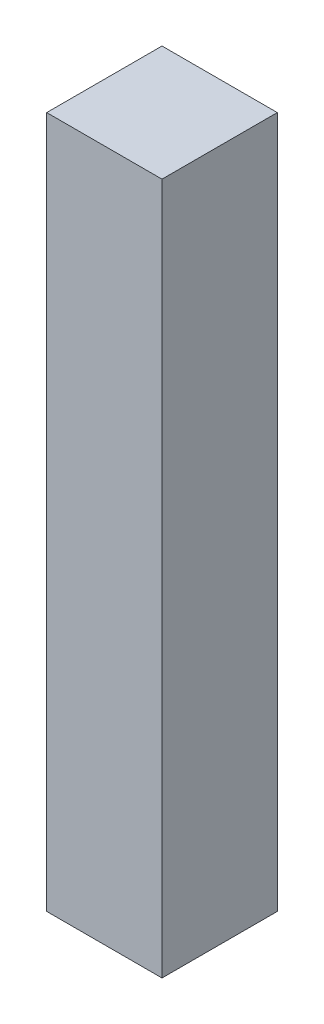
ISO-10303-21;
HEADER;
FILE_DESCRIPTION(('STEP AP214'),'2;1');
FILE_NAME('part.step','',(''),(''),'','','');
FILE_SCHEMA(('AUTOMOTIVE_DESIGN { 1 0 10303 214 1 1 1 1 }'));
ENDSEC;
DATA;
#1=APPLICATION_CONTEXT('core data for automotive mechanical design processes');
#2=APPLICATION_PROTOCOL_DEFINITION('international standard','automotive_design',2000,#1);
#3=PRODUCT_CONTEXT('',#1,'mechanical');
#4=PRODUCT('Part','Part','',(#3));
#5=PRODUCT_RELATED_PRODUCT_CATEGORY('part','',(#4));
#6=PRODUCT_DEFINITION_FORMATION('','',#4);
#7=PRODUCT_DEFINITION_CONTEXT('part definition',#1,'design');
#8=PRODUCT_DEFINITION('design','',#6,#7);
#9=PRODUCT_DEFINITION_SHAPE('','',#8);
#10=(LENGTH_UNIT() NAMED_UNIT(*) SI_UNIT(.MILLI.,.METRE.));
#11=(NAMED_UNIT(*) PLANE_ANGLE_UNIT() SI_UNIT($,.RADIAN.));
#12=(NAMED_UNIT(*) SI_UNIT($,.STERADIAN.) SOLID_ANGLE_UNIT());
#13=UNCERTAINTY_MEASURE_WITH_UNIT(LENGTH_MEASURE(1.E-05),#10,'distance_accuracy_value','');
#14=(GEOMETRIC_REPRESENTATION_CONTEXT(3) GLOBAL_UNCERTAINTY_ASSIGNED_CONTEXT((#13)) GLOBAL_UNIT_ASSIGNED_CONTEXT((#10,
#11,#12)) REPRESENTATION_CONTEXT('',''));
#15=CARTESIAN_POINT('',(0.,0.,0.));
#16=DIRECTION('',(0.,0.,1.));
#17=DIRECTION('',(1.,0.,0.));
#18=AXIS2_PLACEMENT_3D('',#15,#16,#17);
#19=CARTESIAN_POINT('',(0.,30.,0.));
#20=DIRECTION('',(0.,0.,-1.));
#21=DIRECTION('',(-1.,0.,0.));
#22=AXIS2_PLACEMENT_3D('',#19,#20,#21);
#23=PLANE('',#22);
#24=DIRECTION('',(1.,0.,0.));
#25=VECTOR('',#24,1.);
#26=CARTESIAN_POINT('',(0.,0.,0.));
#27=LINE('',#26,#25);
#28=CARTESIAN_POINT('',(0.,0.,0.));
#29=VERTEX_POINT('',#28);
#30=CARTESIAN_POINT('',(5.,0.,0.));
#31=VERTEX_POINT('',#30);
#32=EDGE_CURVE('E98',#29,#31,#27,.T.);
#33=ORIENTED_EDGE('',*,*,#32,.T.);
#34=DIRECTION('',(0.,-1.,0.));
#35=VECTOR('',#34,1.);
#36=CARTESIAN_POINT('',(5.,30.,0.));
#37=LINE('',#36,#35);
#38=CARTESIAN_POINT('',(5.,30.,0.));
#39=VERTEX_POINT('',#38);
#40=EDGE_CURVE('E11',#39,#31,#37,.T.);
#41=ORIENTED_EDGE('',*,*,#40,.F.);
#42=DIRECTION('',(1.,0.,0.));
#43=VECTOR('',#42,1.);
#44=CARTESIAN_POINT('',(0.,30.,0.));
#45=LINE('',#44,#43);
#46=CARTESIAN_POINT('',(0.,30.,0.));
#47=VERTEX_POINT('',#46);
#48=EDGE_CURVE('E84',#47,#39,#45,.T.);
#49=ORIENTED_EDGE('',*,*,#48,.F.);
#50=DIRECTION('',(0.,-1.,0.));
#51=VECTOR('',#50,1.);
#52=CARTESIAN_POINT('',(0.,30.,0.));
#53=LINE('',#52,#51);
#54=EDGE_CURVE('E51',#47,#29,#53,.T.);
#55=ORIENTED_EDGE('',*,*,#54,.T.);
#56=EDGE_LOOP('',(#33,#41,#49,#55));
#57=FACE_BOUND('',#56,.T.);
#58=ADVANCED_FACE('F35',(#57),#23,.F.);
#59=CARTESIAN_POINT('',(5.,30.,0.));
#60=DIRECTION('',(-1.,0.,0.));
#61=DIRECTION('',(0.,0.,1.));
#62=AXIS2_PLACEMENT_3D('',#59,#60,#61);
#63=PLANE('',#62);
#64=DIRECTION('',(0.,0.,-1.));
#65=VECTOR('',#64,1.);
#66=CARTESIAN_POINT('',(5.,0.,0.));
#67=LINE('',#66,#65);
#68=CARTESIAN_POINT('',(5.,0.,-5.));
#69=VERTEX_POINT('',#68);
#70=EDGE_CURVE('E89',#31,#69,#67,.T.);
#71=ORIENTED_EDGE('',*,*,#70,.T.);
#72=DIRECTION('',(0.,-1.,0.));
#73=VECTOR('',#72,1.);
#74=CARTESIAN_POINT('',(5.,30.,-5.));
#75=LINE('',#74,#73);
#76=CARTESIAN_POINT('',(5.,30.,-5.));
#77=VERTEX_POINT('',#76);
#78=EDGE_CURVE('E43',#77,#69,#75,.T.);
#79=ORIENTED_EDGE('',*,*,#78,.F.);
#80=DIRECTION('',(0.,0.,-1.));
#81=VECTOR('',#80,1.);
#82=CARTESIAN_POINT('',(5.,30.,0.));
#83=LINE('',#82,#81);
#84=EDGE_CURVE('E76',#39,#77,#83,.T.);
#85=ORIENTED_EDGE('',*,*,#84,.F.);
#86=ORIENTED_EDGE('',*,*,#40,.T.);
#87=EDGE_LOOP('',(#71,#79,#85,#86));
#88=FACE_BOUND('',#87,.T.);
#89=ADVANCED_FACE('F88',(#88),#63,.F.);
#90=CARTESIAN_POINT('',(0.,30.,-5.));
#91=DIRECTION('',(0.,0.,-1.));
#92=DIRECTION('',(-1.,0.,0.));
#93=AXIS2_PLACEMENT_3D('',#90,#91,#92);
#94=PLANE('',#93);
#95=DIRECTION('',(1.,0.,0.));
#96=VECTOR('',#95,1.);
#97=CARTESIAN_POINT('',(0.,0.,-5.));
#98=LINE('',#97,#96);
#99=CARTESIAN_POINT('',(0.,0.,-5.));
#100=VERTEX_POINT('',#99);
#101=EDGE_CURVE('E101',#100,#69,#98,.T.);
#102=ORIENTED_EDGE('',*,*,#101,.F.);
#103=DIRECTION('',(0.,-1.,0.));
#104=VECTOR('',#103,1.);
#105=CARTESIAN_POINT('',(0.,30.,-5.));
#106=LINE('',#105,#104);
#107=CARTESIAN_POINT('',(0.,30.,-5.));
#108=VERTEX_POINT('',#107);
#109=EDGE_CURVE('E65',#108,#100,#106,.T.);
#110=ORIENTED_EDGE('',*,*,#109,.F.);
#111=DIRECTION('',(1.,0.,0.));
#112=VECTOR('',#111,1.);
#113=CARTESIAN_POINT('',(0.,30.,-5.));
#114=LINE('',#113,#112);
#115=EDGE_CURVE('E83',#108,#77,#114,.T.);
#116=ORIENTED_EDGE('',*,*,#115,.T.);
#117=ORIENTED_EDGE('',*,*,#78,.T.);
#118=EDGE_LOOP('',(#102,#110,#116,#117));
#119=FACE_BOUND('',#118,.T.);
#120=ADVANCED_FACE('F92',(#119),#94,.T.);
#121=CARTESIAN_POINT('',(0.,30.,0.));
#122=DIRECTION('',(-1.,0.,0.));
#123=DIRECTION('',(0.,0.,1.));
#124=AXIS2_PLACEMENT_3D('',#121,#122,#123);
#125=PLANE('',#124);
#126=DIRECTION('',(0.,0.,-1.));
#127=VECTOR('',#126,1.);
#128=CARTESIAN_POINT('',(0.,0.,0.));
#129=LINE('',#128,#127);
#130=EDGE_CURVE('E103',#29,#100,#129,.T.);
#131=ORIENTED_EDGE('',*,*,#130,.F.);
#132=ORIENTED_EDGE('',*,*,#54,.F.);
#133=DIRECTION('',(0.,0.,-1.));
#134=VECTOR('',#133,1.);
#135=CARTESIAN_POINT('',(0.,30.,0.));
#136=LINE('',#135,#134);
#137=EDGE_CURVE('E93',#47,#108,#136,.T.);
#138=ORIENTED_EDGE('',*,*,#137,.T.);
#139=ORIENTED_EDGE('',*,*,#109,.T.);
#140=EDGE_LOOP('',(#131,#132,#138,#139));
#141=FACE_BOUND('',#140,.T.);
#142=ADVANCED_FACE('F109',(#141),#125,.T.);
#143=CARTESIAN_POINT('',(0.,30.,0.));
#144=DIRECTION('',(0.,1.,0.));
#145=DIRECTION('',(0.,0.,1.));
#146=AXIS2_PLACEMENT_3D('',#143,#144,#145);
#147=PLANE('',#146);
#148=ORIENTED_EDGE('',*,*,#48,.T.);
#149=ORIENTED_EDGE('',*,*,#84,.T.);
#150=ORIENTED_EDGE('',*,*,#115,.F.);
#151=ORIENTED_EDGE('',*,*,#137,.F.);
#152=EDGE_LOOP('',(#148,#149,#150,#151));
#153=FACE_BOUND('',#152,.T.);
#154=ADVANCED_FACE('F80',(#153),#147,.T.);
#155=CARTESIAN_POINT('',(0.,0.,0.));
#156=DIRECTION('',(0.,1.,0.));
#157=DIRECTION('',(0.,0.,1.));
#158=AXIS2_PLACEMENT_3D('',#155,#156,#157);
#159=PLANE('',#158);
#160=ORIENTED_EDGE('',*,*,#32,.F.);
#161=ORIENTED_EDGE('',*,*,#130,.T.);
#162=ORIENTED_EDGE('',*,*,#101,.T.);
#163=ORIENTED_EDGE('',*,*,#70,.F.);
#164=EDGE_LOOP('',(#160,#161,#162,#163));
#165=FACE_BOUND('',#164,.T.);
#166=ADVANCED_FACE('F108',(#165),#159,.F.);
#167=CLOSED_SHELL('',(#58,#89,#120,#142,#154,#166));
#168=MANIFOLD_SOLID_BREP('B2',#167);
#169=ADVANCED_BREP_SHAPE_REPRESENTATION('',(#18,#168),#14);
#170=SHAPE_DEFINITION_REPRESENTATION(#9,#169);
ENDSEC;
END-ISO-10303-21;
